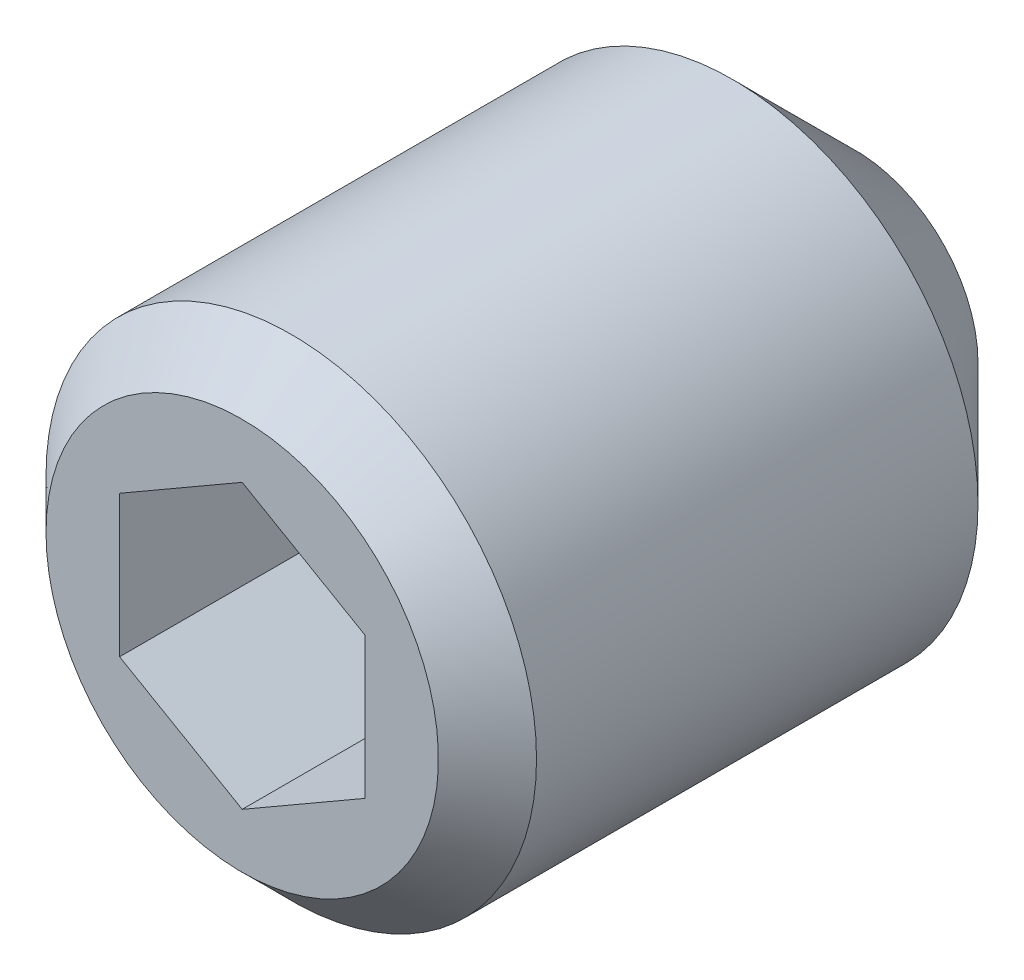
ISO-10303-21;
HEADER;
FILE_DESCRIPTION(('STEP AP214'),'2;1');
FILE_NAME('part.step','',(''),(''),'','','');
FILE_SCHEMA(('AUTOMOTIVE_DESIGN { 1 0 10303 214 1 1 1 1 }'));
ENDSEC;
DATA;
#1=APPLICATION_CONTEXT('core data for automotive mechanical design processes');
#2=APPLICATION_PROTOCOL_DEFINITION('international standard','automotive_design',2000,#1);
#3=PRODUCT_CONTEXT('',#1,'mechanical');
#4=PRODUCT('Part','Part','',(#3));
#5=PRODUCT_RELATED_PRODUCT_CATEGORY('part','',(#4));
#6=PRODUCT_DEFINITION_FORMATION('','',#4);
#7=PRODUCT_DEFINITION_CONTEXT('part definition',#1,'design');
#8=PRODUCT_DEFINITION('design','',#6,#7);
#9=PRODUCT_DEFINITION_SHAPE('','',#8);
#10=(LENGTH_UNIT() NAMED_UNIT(*) SI_UNIT(.MILLI.,.METRE.));
#11=(NAMED_UNIT(*) PLANE_ANGLE_UNIT() SI_UNIT($,.RADIAN.));
#12=(NAMED_UNIT(*) SI_UNIT($,.STERADIAN.) SOLID_ANGLE_UNIT());
#13=UNCERTAINTY_MEASURE_WITH_UNIT(LENGTH_MEASURE(1.E-05),#10,'distance_accuracy_value','');
#14=(GEOMETRIC_REPRESENTATION_CONTEXT(3) GLOBAL_UNCERTAINTY_ASSIGNED_CONTEXT((#13)) GLOBAL_UNIT_ASSIGNED_CONTEXT((#10,
#11,#12)) REPRESENTATION_CONTEXT('',''));
#15=CARTESIAN_POINT('',(0.,0.,0.));
#16=DIRECTION('',(0.,0.,1.));
#17=DIRECTION('',(1.,0.,0.));
#18=AXIS2_PLACEMENT_3D('',#15,#16,#17);
#19=CARTESIAN_POINT('',(0.,0.,-3.175));
#20=DIRECTION('',(0.,0.,1.));
#21=DIRECTION('',(1.,0.,0.));
#22=AXIS2_PLACEMENT_3D('',#19,#20,#21);
#23=PLANE('',#22);
#24=DIRECTION('',(-0.866025403784429,0.500000000000017,0.));
#25=VECTOR('',#24,1.);
#26=CARTESIAN_POINT('',(1.5875,0.91654355233849,-3.175));
#27=LINE('',#26,#25);
#28=CARTESIAN_POINT('',(1.5875,0.91654355233849,-3.175));
#29=VERTEX_POINT('',#28);
#30=CARTESIAN_POINT('',(0.,1.83308710467701,-3.175));
#31=VERTEX_POINT('',#30);
#32=EDGE_CURVE('P0_E72',#29,#31,#27,.T.);
#33=ORIENTED_EDGE('',*,*,#32,.T.);
#34=DIRECTION('',(-0.866025403784429,-0.500000000000017,0.));
#35=VECTOR('',#34,1.);
#36=CARTESIAN_POINT('',(0.,1.83308710467698,-3.175));
#37=LINE('',#36,#35);
#38=CARTESIAN_POINT('',(-1.58749999999999,0.916543552338475,-3.175));
#39=VERTEX_POINT('',#38);
#40=EDGE_CURVE('P0_E126',#31,#39,#37,.T.);
#41=ORIENTED_EDGE('',*,*,#40,.T.);
#42=DIRECTION('',(0.,1.,0.));
#43=VECTOR('',#42,1.);
#44=CARTESIAN_POINT('',(-1.5875,0.91654355233849,-3.175));
#45=LINE('',#44,#43);
#46=CARTESIAN_POINT('',(-1.5875,-0.91654355233849,-3.175));
#47=VERTEX_POINT('',#46);
#48=EDGE_CURVE('P0_E131',#39,#47,#45,.F.);
#49=ORIENTED_EDGE('',*,*,#48,.T.);
#50=DIRECTION('',(0.866025403784429,-0.500000000000017,0.));
#51=VECTOR('',#50,1.);
#52=CARTESIAN_POINT('',(-1.5875,-0.91654355233849,-3.175));
#53=LINE('',#52,#51);
#54=CARTESIAN_POINT('',(0.,-1.833087104677,-3.175));
#55=VERTEX_POINT('',#54);
#56=EDGE_CURVE('P0_E135',#47,#55,#53,.T.);
#57=ORIENTED_EDGE('',*,*,#56,.T.);
#58=DIRECTION('',(0.866025403784429,0.500000000000017,0.));
#59=VECTOR('',#58,1.);
#60=CARTESIAN_POINT('',(0.,-1.83308710467698,-3.175));
#61=LINE('',#60,#59);
#62=CARTESIAN_POINT('',(1.58749999999999,-0.916543552338475,-3.175));
#63=VERTEX_POINT('',#62);
#64=EDGE_CURVE('P0_E75',#55,#63,#61,.T.);
#65=ORIENTED_EDGE('',*,*,#64,.T.);
#66=DIRECTION('',(0.,1.,0.));
#67=VECTOR('',#66,1.);
#68=CARTESIAN_POINT('',(1.5875,-0.91654355233849,-3.175));
#69=LINE('',#68,#67);
#70=EDGE_CURVE('P0_E70',#63,#29,#69,.T.);
#71=ORIENTED_EDGE('',*,*,#70,.T.);
#72=EDGE_LOOP('',(#33,#41,#49,#57,#65,#71));
#73=FACE_BOUND('',#72,.T.);
#74=ADVANCED_FACE('P0_F17',(#73),#23,.T.);
#75=CARTESIAN_POINT('',(1.5875,0.91654355233849,0.));
#76=DIRECTION('',(0.500000000000017,0.866025403784429,0.));
#77=DIRECTION('',(-0.866025403784429,0.500000000000017,0.));
#78=AXIS2_PLACEMENT_3D('',#75,#76,#77);
#79=PLANE('',#78);
#80=ORIENTED_EDGE('',*,*,#32,.F.);
#81=DIRECTION('',(0.,0.,-1.));
#82=VECTOR('',#81,1.);
#83=CARTESIAN_POINT('',(1.5875,0.91654355233849,0.));
#84=LINE('',#83,#82);
#85=CARTESIAN_POINT('',(1.5875,0.91654355233849,0.));
#86=VERTEX_POINT('',#85);
#87=EDGE_CURVE('P0_E79',#29,#86,#84,.F.);
#88=ORIENTED_EDGE('',*,*,#87,.T.);
#89=DIRECTION('',(0.866025403784448,-0.499999999999983,0.));
#90=VECTOR('',#89,1.);
#91=CARTESIAN_POINT('',(0.,1.83308710467698,0.));
#92=LINE('',#91,#90);
#93=CARTESIAN_POINT('',(0.,1.83308710467701,0.));
#94=VERTEX_POINT('',#93);
#95=EDGE_CURVE('P0_E121',#94,#86,#92,.T.);
#96=ORIENTED_EDGE('',*,*,#95,.F.);
#97=DIRECTION('',(0.,0.,1.));
#98=VECTOR('',#97,1.);
#99=CARTESIAN_POINT('',(0.,1.83308710467698,0.));
#100=LINE('',#99,#98);
#101=EDGE_CURVE('P0_E85',#94,#31,#100,.F.);
#102=ORIENTED_EDGE('',*,*,#101,.T.);
#103=EDGE_LOOP('',(#80,#88,#96,#102));
#104=FACE_BOUND('',#103,.T.);
#105=ADVANCED_FACE('P0_F82',(#104),#79,.F.);
#106=CARTESIAN_POINT('',(1.5875,-0.91654355233849,0.));
#107=DIRECTION('',(1.,0.,0.));
#108=DIRECTION('',(0.,0.,-1.));
#109=AXIS2_PLACEMENT_3D('',#106,#107,#108);
#110=PLANE('',#109);
#111=ORIENTED_EDGE('',*,*,#70,.F.);
#112=DIRECTION('',(0.,0.,1.));
#113=VECTOR('',#112,1.);
#114=CARTESIAN_POINT('',(1.58749999999996,-0.916543552338428,0.));
#115=LINE('',#114,#113);
#116=CARTESIAN_POINT('',(1.58749999999999,-0.916543552338475,0.));
#117=VERTEX_POINT('',#116);
#118=EDGE_CURVE('P0_E93',#63,#117,#115,.T.);
#119=ORIENTED_EDGE('',*,*,#118,.T.);
#120=DIRECTION('',(0.,1.,0.));
#121=VECTOR('',#120,1.);
#122=CARTESIAN_POINT('',(1.5875,0.,0.));
#123=LINE('',#122,#121);
#124=EDGE_CURVE('P0_E90',#86,#117,#123,.F.);
#125=ORIENTED_EDGE('',*,*,#124,.F.);
#126=ORIENTED_EDGE('',*,*,#87,.F.);
#127=EDGE_LOOP('',(#111,#119,#125,#126));
#128=FACE_BOUND('',#127,.T.);
#129=ADVANCED_FACE('P0_F88',(#128),#110,.F.);
#130=CARTESIAN_POINT('',(0.,-1.83308710467698,0.));
#131=DIRECTION('',(0.500000000000017,-0.866025403784429,0.));
#132=DIRECTION('',(0.866025403784429,0.500000000000017,0.));
#133=AXIS2_PLACEMENT_3D('',#130,#131,#132);
#134=PLANE('',#133);
#135=ORIENTED_EDGE('',*,*,#64,.F.);
#136=DIRECTION('',(0.,0.,1.));
#137=VECTOR('',#136,1.);
#138=CARTESIAN_POINT('',(0.,-1.83308710467704,0.));
#139=LINE('',#138,#137);
#140=CARTESIAN_POINT('',(0.,-1.833087104677,0.));
#141=VERTEX_POINT('',#140);
#142=EDGE_CURVE('P0_E133',#55,#141,#139,.T.);
#143=ORIENTED_EDGE('',*,*,#142,.T.);
#144=DIRECTION('',(-0.866025403784448,-0.499999999999983,0.));
#145=VECTOR('',#144,1.);
#146=CARTESIAN_POINT('',(1.5875,-0.91654355233849,0.));
#147=LINE('',#146,#145);
#148=EDGE_CURVE('P0_E117',#117,#141,#147,.T.);
#149=ORIENTED_EDGE('',*,*,#148,.F.);
#150=ORIENTED_EDGE('',*,*,#118,.F.);
#151=EDGE_LOOP('',(#135,#143,#149,#150));
#152=FACE_BOUND('',#151,.T.);
#153=ADVANCED_FACE('P0_F138',(#152),#134,.F.);
#154=CARTESIAN_POINT('',(-1.5875,-0.91654355233849,0.));
#155=DIRECTION('',(-0.500000000000017,-0.866025403784429,0.));
#156=DIRECTION('',(0.866025403784429,-0.500000000000017,0.));
#157=AXIS2_PLACEMENT_3D('',#154,#155,#156);
#158=PLANE('',#157);
#159=ORIENTED_EDGE('',*,*,#56,.F.);
#160=DIRECTION('',(0.,0.,1.));
#161=VECTOR('',#160,1.);
#162=CARTESIAN_POINT('',(-1.5875,-0.91654355233849,0.));
#163=LINE('',#162,#161);
#164=CARTESIAN_POINT('',(-1.5875,-0.91654355233849,0.));
#165=VERTEX_POINT('',#164);
#166=EDGE_CURVE('P0_E129',#47,#165,#163,.T.);
#167=ORIENTED_EDGE('',*,*,#166,.T.);
#168=DIRECTION('',(-0.866025403784448,0.499999999999983,0.));
#169=VECTOR('',#168,1.);
#170=CARTESIAN_POINT('',(0.,-1.83308710467698,0.));
#171=LINE('',#170,#169);
#172=EDGE_CURVE('P0_E112',#141,#165,#171,.T.);
#173=ORIENTED_EDGE('',*,*,#172,.F.);
#174=ORIENTED_EDGE('',*,*,#142,.F.);
#175=EDGE_LOOP('',(#159,#167,#173,#174));
#176=FACE_BOUND('',#175,.T.);
#177=ADVANCED_FACE('P0_F149',(#176),#158,.F.);
#178=CARTESIAN_POINT('',(-1.5875,0.91654355233849,0.));
#179=DIRECTION('',(-1.,0.,0.));
#180=DIRECTION('',(0.,0.,1.));
#181=AXIS2_PLACEMENT_3D('',#178,#179,#180);
#182=PLANE('',#181);
#183=ORIENTED_EDGE('',*,*,#48,.F.);
#184=DIRECTION('',(0.,0.,1.));
#185=VECTOR('',#184,1.);
#186=CARTESIAN_POINT('',(-1.58749999999996,0.916543552338428,0.));
#187=LINE('',#186,#185);
#188=CARTESIAN_POINT('',(-1.58749999999999,0.916543552338475,0.));
#189=VERTEX_POINT('',#188);
#190=EDGE_CURVE('P0_E35',#39,#189,#187,.T.);
#191=ORIENTED_EDGE('',*,*,#190,.T.);
#192=DIRECTION('',(0.,1.,0.));
#193=VECTOR('',#192,1.);
#194=CARTESIAN_POINT('',(-1.5875,0.,0.));
#195=LINE('',#194,#193);
#196=EDGE_CURVE('P0_E108',#165,#189,#195,.T.);
#197=ORIENTED_EDGE('',*,*,#196,.F.);
#198=ORIENTED_EDGE('',*,*,#166,.F.);
#199=EDGE_LOOP('',(#183,#191,#197,#198));
#200=FACE_BOUND('',#199,.T.);
#201=ADVANCED_FACE('P0_F147',(#200),#182,.F.);
#202=CARTESIAN_POINT('',(0.,1.83308710467698,0.));
#203=DIRECTION('',(-0.500000000000017,0.866025403784429,0.));
#204=DIRECTION('',(-0.866025403784429,-0.500000000000017,0.));
#205=AXIS2_PLACEMENT_3D('',#202,#203,#204);
#206=PLANE('',#205);
#207=ORIENTED_EDGE('',*,*,#40,.F.);
#208=ORIENTED_EDGE('',*,*,#101,.F.);
#209=DIRECTION('',(0.866025403784448,0.499999999999983,0.));
#210=VECTOR('',#209,1.);
#211=CARTESIAN_POINT('',(-1.5875,0.91654355233849,0.));
#212=LINE('',#211,#210);
#213=EDGE_CURVE('P0_E104',#189,#94,#212,.T.);
#214=ORIENTED_EDGE('',*,*,#213,.F.);
#215=ORIENTED_EDGE('',*,*,#190,.F.);
#216=EDGE_LOOP('',(#207,#208,#214,#215));
#217=FACE_BOUND('',#216,.T.);
#218=ADVANCED_FACE('P0_F144',(#217),#206,.F.);
#219=CARTESIAN_POINT('',(0.,0.,-7.93749999996862));
#220=DIRECTION('',(0.,0.,-1.));
#221=DIRECTION('',(-1.,0.,0.));
#222=AXIS2_PLACEMENT_3D('',#219,#220,#221);
#223=CONICAL_SURFACE('',#222,1.46049999989373,1.02974425845777);
#224=CARTESIAN_POINT('',(0.,2.27373675443232E-10,-7.05994306579782));
#225=VERTEX_POINT('',#224);
#226=VERTEX_LOOP('',#225);
#227=FACE_BOUND('',#226,.T.);
#228=CARTESIAN_POINT('',(0.,0.,-7.93750000003693));
#229=DIRECTION('',(0.,0.,-1.));
#230=DIRECTION('',(-1.,0.,0.));
#231=AXIS2_PLACEMENT_3D('',#228,#229,#230);
#232=CIRCLE('',#231,1.46050000000741);
#233=CARTESIAN_POINT('',(-1.46050000000741,0.,-7.93750000003693));
#234=VERTEX_POINT('',#233);
#235=EDGE_CURVE('P0_E20',#234,#234,#232,.T.);
#236=ORIENTED_EDGE('',*,*,#235,.T.);
#237=EDGE_LOOP('',(#236));
#238=FACE_BOUND('',#237,.T.);
#239=ADVANCED_FACE('P0_F181',(#227,#238),#223,.F.);
#240=CARTESIAN_POINT('',(0.,0.,0.));
#241=DIRECTION('',(0.,0.,1.));
#242=DIRECTION('',(1.,0.,0.));
#243=AXIS2_PLACEMENT_3D('',#240,#241,#242);
#244=PLANE('',#243);
#245=ORIENTED_EDGE('',*,*,#196,.T.);
#246=ORIENTED_EDGE('',*,*,#213,.T.);
#247=ORIENTED_EDGE('',*,*,#95,.T.);
#248=ORIENTED_EDGE('',*,*,#124,.T.);
#249=ORIENTED_EDGE('',*,*,#148,.T.);
#250=ORIENTED_EDGE('',*,*,#172,.T.);
#251=EDGE_LOOP('',(#245,#246,#247,#248,#249,#250));
#252=FACE_BOUND('',#251,.T.);
#253=CARTESIAN_POINT('',(0.,0.,5.88897819397971E-08));
#254=DIRECTION('',(0.,0.,-1.));
#255=DIRECTION('',(-1.,0.,0.));
#256=AXIS2_PLACEMENT_3D('',#253,#254,#255);
#257=CIRCLE('',#256,2.53999987677389);
#258=CARTESIAN_POINT('',(-2.53999987677389,0.,5.88897819397971E-08));
#259=VERTEX_POINT('',#258);
#260=EDGE_CURVE('P0_E99',#259,#259,#257,.T.);
#261=ORIENTED_EDGE('',*,*,#260,.F.);
#262=EDGE_LOOP('',(#261));
#263=FACE_BOUND('',#262,.T.);
#264=ADVANCED_FACE('P0_F141',(#252,#263),#244,.T.);
#265=CARTESIAN_POINT('',(0.,0.,-7.9375));
#266=DIRECTION('',(0.,0.,1.));
#267=DIRECTION('',(1.,0.,0.));
#268=AXIS2_PLACEMENT_3D('',#265,#266,#267);
#269=PLANE('',#268);
#270=ORIENTED_EDGE('',*,*,#235,.F.);
#271=EDGE_LOOP('',(#270));
#272=FACE_BOUND('',#271,.T.);
#273=CARTESIAN_POINT('',(0.,0.,-7.93749999996862));
#274=DIRECTION('',(0.,0.,1.));
#275=DIRECTION('',(1.,0.,0.));
#276=AXIS2_PLACEMENT_3D('',#273,#274,#275);
#277=CIRCLE('',#276,1.58749999997099);
#278=CARTESIAN_POINT('',(1.58749999997099,0.,-7.93749999996862));
#279=VERTEX_POINT('',#278);
#280=EDGE_CURVE('P0_E97',#279,#279,#277,.T.);
#281=ORIENTED_EDGE('',*,*,#280,.F.);
#282=EDGE_LOOP('',(#281));
#283=FACE_BOUND('',#282,.T.);
#284=ADVANCED_FACE('P0_F174',(#272,#283),#269,.F.);
#285=CARTESIAN_POINT('',(0.,0.,-0.635000155114085));
#286=DIRECTION('',(0.,0.,-1.));
#287=DIRECTION('',(-1.,0.,0.));
#288=AXIS2_PLACEMENT_3D('',#285,#286,#287);
#289=CONICAL_SURFACE('',#288,3.17500007463423,0.785398150686011);
#290=CARTESIAN_POINT('',(0.,0.,-0.635000229909624));
#291=DIRECTION('',(0.,0.,1.));
#292=DIRECTION('',(1.,0.,0.));
#293=AXIS2_PLACEMENT_3D('',#290,#291,#292);
#294=CIRCLE('',#293,3.175);
#295=CARTESIAN_POINT('',(3.175,0.,-0.635000229909624));
#296=VERTEX_POINT('',#295);
#297=EDGE_CURVE('P0_E26',#296,#296,#294,.F.);
#298=ORIENTED_EDGE('',*,*,#297,.F.);
#299=EDGE_LOOP('',(#298));
#300=FACE_BOUND('',#299,.T.);
#301=ORIENTED_EDGE('',*,*,#260,.T.);
#302=EDGE_LOOP('',(#301));
#303=FACE_BOUND('',#302,.T.);
#304=ADVANCED_FACE('P0_F167',(#300,#303),#289,.T.);
#305=CARTESIAN_POINT('',(0.,0.,-6.35000000005448));
#306=DIRECTION('',(0.,0.,1.));
#307=DIRECTION('',(1.,0.,0.));
#308=AXIS2_PLACEMENT_3D('',#305,#306,#307);
#309=CONICAL_SURFACE('',#308,3.17499999988513,0.785398163397448);
#310=CARTESIAN_POINT('',(0.,0.,-6.35));
#311=DIRECTION('',(0.,0.,1.));
#312=DIRECTION('',(1.,0.,0.));
#313=AXIS2_PLACEMENT_3D('',#310,#311,#312);
#314=CIRCLE('',#313,3.175);
#315=CARTESIAN_POINT('',(3.175,0.,-6.35));
#316=VERTEX_POINT('',#315);
#317=EDGE_CURVE('P0_E11',#316,#316,#314,.T.);
#318=ORIENTED_EDGE('',*,*,#317,.F.);
#319=EDGE_LOOP('',(#318));
#320=FACE_BOUND('',#319,.T.);
#321=ORIENTED_EDGE('',*,*,#280,.T.);
#322=EDGE_LOOP('',(#321));
#323=FACE_BOUND('',#322,.T.);
#324=ADVANCED_FACE('P0_F161',(#320,#323),#309,.T.);
#325=CARTESIAN_POINT('',(0.,0.,-8.334375));
#326=DIRECTION('',(0.,0.,1.));
#327=DIRECTION('',(1.,0.,0.));
#328=AXIS2_PLACEMENT_3D('',#325,#326,#327);
#329=CYLINDRICAL_SURFACE('',#328,3.175);
#330=ORIENTED_EDGE('',*,*,#297,.T.);
#331=EDGE_LOOP('',(#330));
#332=FACE_BOUND('',#331,.T.);
#333=ORIENTED_EDGE('',*,*,#317,.T.);
#334=EDGE_LOOP('',(#333));
#335=FACE_BOUND('',#334,.T.);
#336=ADVANCED_FACE('P0_F159',(#332,#335),#329,.T.);
#337=CLOSED_SHELL('',(#74,#105,#129,#153,#177,#201,#218,#239,#264,#284,#304,#324,#336));
#338=MANIFOLD_SOLID_BREP('P0_B1',#337);
#339=CARTESIAN_POINT('',(0.,0.,0.));
#340=DIRECTION('',(0.,0.,-1.));
#341=DIRECTION('',(-1.,0.,0.));
#342=AXIS2_PLACEMENT_3D('',#339,#340,#341);
#343=CYLINDRICAL_SURFACE('',#342,2.48793);
#344=CARTESIAN_POINT('',(0.,0.,-6.35));
#345=DIRECTION('',(0.,0.,-1.));
#346=DIRECTION('',(-1.,0.,0.));
#347=AXIS2_PLACEMENT_3D('',#344,#345,#346);
#348=CIRCLE('',#347,2.48793);
#349=CARTESIAN_POINT('',(-2.48793,0.,-6.35));
#350=VERTEX_POINT('',#349);
#351=EDGE_CURVE('P1_E16',#350,#350,#348,.F.);
#352=ORIENTED_EDGE('',*,*,#351,.T.);
#353=EDGE_LOOP('',(#352));
#354=FACE_BOUND('',#353,.T.);
#355=CARTESIAN_POINT('',(0.,0.,0.));
#356=DIRECTION('',(0.,0.,-1.));
#357=DIRECTION('',(-1.,0.,0.));
#358=AXIS2_PLACEMENT_3D('',#355,#356,#357);
#359=CIRCLE('',#358,2.48793);
#360=CARTESIAN_POINT('',(-2.48793,0.,0.));
#361=VERTEX_POINT('',#360);
#362=EDGE_CURVE('P1_E10',#361,#361,#359,.T.);
#363=ORIENTED_EDGE('',*,*,#362,.T.);
#364=EDGE_LOOP('',(#363));
#365=FACE_BOUND('',#364,.T.);
#366=ADVANCED_FACE('P1_F15',(#354,#365),#343,.T.);
#367=OPEN_SHELL('',(#366));
#368=SHELL_BASED_SURFACE_MODEL('P1_B1',(#367));
#369=ADVANCED_BREP_SHAPE_REPRESENTATION('',(#18,#338),#14);
#370=MANIFOLD_SURFACE_SHAPE_REPRESENTATION('',(#18,#368),#14);
#371=SHAPE_REPRESENTATION('',(#18),#14);
#372=SHAPE_DEFINITION_REPRESENTATION(#9,#371);
#373=SHAPE_REPRESENTATION_RELATIONSHIP('','',#371,#369);
#374=SHAPE_REPRESENTATION_RELATIONSHIP('','',#371,#370);
ENDSEC;
END-ISO-10303-21;
